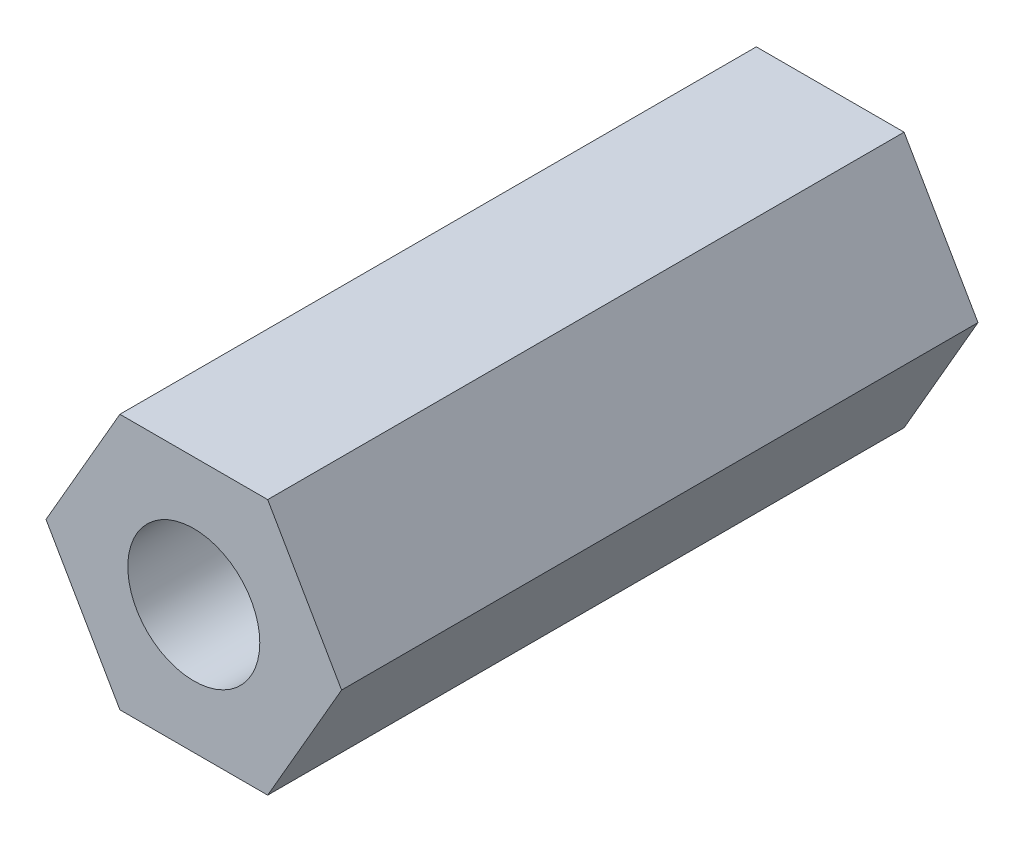
ISO-10303-21;
HEADER;
FILE_DESCRIPTION(('STEP AP214'),'2;1');
FILE_NAME('part.step','',(''),(''),'','','');
FILE_SCHEMA(('AUTOMOTIVE_DESIGN { 1 0 10303 214 1 1 1 1 }'));
ENDSEC;
DATA;
#1=APPLICATION_CONTEXT('core data for automotive mechanical design processes');
#2=APPLICATION_PROTOCOL_DEFINITION('international standard','automotive_design',2000,#1);
#3=PRODUCT_CONTEXT('',#1,'mechanical');
#4=PRODUCT('Part','Part','',(#3));
#5=PRODUCT_RELATED_PRODUCT_CATEGORY('part','',(#4));
#6=PRODUCT_DEFINITION_FORMATION('','',#4);
#7=PRODUCT_DEFINITION_CONTEXT('part definition',#1,'design');
#8=PRODUCT_DEFINITION('design','',#6,#7);
#9=PRODUCT_DEFINITION_SHAPE('','',#8);
#10=(LENGTH_UNIT() NAMED_UNIT(*) SI_UNIT(.MILLI.,.METRE.));
#11=(NAMED_UNIT(*) PLANE_ANGLE_UNIT() SI_UNIT($,.RADIAN.));
#12=(NAMED_UNIT(*) SI_UNIT($,.STERADIAN.) SOLID_ANGLE_UNIT());
#13=UNCERTAINTY_MEASURE_WITH_UNIT(LENGTH_MEASURE(1.E-05),#10,'distance_accuracy_value','');
#14=(GEOMETRIC_REPRESENTATION_CONTEXT(3) GLOBAL_UNCERTAINTY_ASSIGNED_CONTEXT((#13)) GLOBAL_UNIT_ASSIGNED_CONTEXT((#10,
#11,#12)) REPRESENTATION_CONTEXT('',''));
#15=CARTESIAN_POINT('',(0.,0.,0.));
#16=DIRECTION('',(0.,0.,1.));
#17=DIRECTION('',(1.,0.,0.));
#18=AXIS2_PLACEMENT_3D('',#15,#16,#17);
#19=CARTESIAN_POINT('',(0.,0.,13.5));
#20=DIRECTION('',(0.,0.,1.));
#21=DIRECTION('',(1.,0.,0.));
#22=AXIS2_PLACEMENT_3D('',#19,#20,#21);
#23=PLANE('',#22);
#24=DIRECTION('',(1.,0.,0.));
#25=VECTOR('',#24,1.);
#26=CARTESIAN_POINT('',(-1.56750598084983,-2.715,13.5));
#27=LINE('',#26,#25);
#28=CARTESIAN_POINT('',(-1.56750598084983,-2.715,13.5));
#29=VERTEX_POINT('',#28);
#30=CARTESIAN_POINT('',(1.56750598084983,-2.715,13.5));
#31=VERTEX_POINT('',#30);
#32=EDGE_CURVE('E146',#29,#31,#27,.T.);
#33=ORIENTED_EDGE('',*,*,#32,.T.);
#34=DIRECTION('',(0.5,0.866025403784439,0.));
#35=VECTOR('',#34,1.);
#36=CARTESIAN_POINT('',(1.56750598084983,-2.715,13.5));
#37=LINE('',#36,#35);
#38=CARTESIAN_POINT('',(3.13501196169967,0.,13.5));
#39=VERTEX_POINT('',#38);
#40=EDGE_CURVE('E94',#31,#39,#37,.T.);
#41=ORIENTED_EDGE('',*,*,#40,.T.);
#42=DIRECTION('',(-0.5,0.866025403784439,0.));
#43=VECTOR('',#42,1.);
#44=CARTESIAN_POINT('',(3.13501196169967,0.,13.5));
#45=LINE('',#44,#43);
#46=CARTESIAN_POINT('',(1.56750598084983,2.715,13.5));
#47=VERTEX_POINT('',#46);
#48=EDGE_CURVE('E107',#39,#47,#45,.T.);
#49=ORIENTED_EDGE('',*,*,#48,.T.);
#50=DIRECTION('',(-1.,0.,0.));
#51=VECTOR('',#50,1.);
#52=CARTESIAN_POINT('',(1.56750598084983,2.715,13.5));
#53=LINE('',#52,#51);
#54=CARTESIAN_POINT('',(-1.56750598084983,2.715,13.5));
#55=VERTEX_POINT('',#54);
#56=EDGE_CURVE('E101',#47,#55,#53,.T.);
#57=ORIENTED_EDGE('',*,*,#56,.T.);
#58=DIRECTION('',(-0.5,-0.866025403784439,0.));
#59=VECTOR('',#58,1.);
#60=CARTESIAN_POINT('',(-1.56750598084983,2.715,13.5));
#61=LINE('',#60,#59);
#62=CARTESIAN_POINT('',(-3.13501196169967,0.,13.5));
#63=VERTEX_POINT('',#62);
#64=EDGE_CURVE('E105',#55,#63,#61,.T.);
#65=ORIENTED_EDGE('',*,*,#64,.T.);
#66=DIRECTION('',(0.5,-0.866025403784438,0.));
#67=VECTOR('',#66,1.);
#68=CARTESIAN_POINT('',(-3.13501196169967,0.,13.5));
#69=LINE('',#68,#67);
#70=EDGE_CURVE('E57',#63,#29,#69,.T.);
#71=ORIENTED_EDGE('',*,*,#70,.T.);
#72=EDGE_LOOP('',(#33,#41,#49,#57,#65,#71));
#73=FACE_BOUND('',#72,.T.);
#74=CARTESIAN_POINT('',(0.,0.,13.5));
#75=DIRECTION('',(0.,0.,1.));
#76=DIRECTION('',(1.,0.,0.));
#77=AXIS2_PLACEMENT_3D('',#74,#75,#76);
#78=CIRCLE('',#77,1.4);
#79=CARTESIAN_POINT('',(1.4,0.,13.5));
#80=VERTEX_POINT('',#79);
#81=EDGE_CURVE('E134',#80,#80,#78,.T.);
#82=ORIENTED_EDGE('',*,*,#81,.F.);
#83=EDGE_LOOP('',(#82));
#84=FACE_BOUND('',#83,.T.);
#85=ADVANCED_FACE('F39',(#73,#84),#23,.T.);
#86=CARTESIAN_POINT('',(0.,0.,0.));
#87=DIRECTION('',(0.,0.,1.));
#88=DIRECTION('',(1.,0.,0.));
#89=AXIS2_PLACEMENT_3D('',#86,#87,#88);
#90=PLANE('',#89);
#91=DIRECTION('',(1.,0.,0.));
#92=VECTOR('',#91,1.);
#93=CARTESIAN_POINT('',(-1.56750598084983,-2.715,0.));
#94=LINE('',#93,#92);
#95=CARTESIAN_POINT('',(-1.56750598084983,-2.715,0.));
#96=VERTEX_POINT('',#95);
#97=CARTESIAN_POINT('',(1.56750598084983,-2.715,0.));
#98=VERTEX_POINT('',#97);
#99=EDGE_CURVE('E129',#96,#98,#94,.T.);
#100=ORIENTED_EDGE('',*,*,#99,.F.);
#101=DIRECTION('',(0.5,-0.866025403784438,0.));
#102=VECTOR('',#101,1.);
#103=CARTESIAN_POINT('',(-3.13501196169967,0.,0.));
#104=LINE('',#103,#102);
#105=CARTESIAN_POINT('',(-3.13501196169967,0.,0.));
#106=VERTEX_POINT('',#105);
#107=EDGE_CURVE('E86',#106,#96,#104,.T.);
#108=ORIENTED_EDGE('',*,*,#107,.F.);
#109=DIRECTION('',(-0.5,-0.866025403784439,0.));
#110=VECTOR('',#109,1.);
#111=CARTESIAN_POINT('',(-1.56750598084983,2.715,0.));
#112=LINE('',#111,#110);
#113=CARTESIAN_POINT('',(-1.56750598084983,2.715,0.));
#114=VERTEX_POINT('',#113);
#115=EDGE_CURVE('E80',#114,#106,#112,.T.);
#116=ORIENTED_EDGE('',*,*,#115,.F.);
#117=DIRECTION('',(-1.,0.,0.));
#118=VECTOR('',#117,1.);
#119=CARTESIAN_POINT('',(1.56750598084983,2.715,0.));
#120=LINE('',#119,#118);
#121=CARTESIAN_POINT('',(1.56750598084983,2.715,0.));
#122=VERTEX_POINT('',#121);
#123=EDGE_CURVE('E116',#122,#114,#120,.T.);
#124=ORIENTED_EDGE('',*,*,#123,.F.);
#125=DIRECTION('',(-0.5,0.866025403784439,0.));
#126=VECTOR('',#125,1.);
#127=CARTESIAN_POINT('',(3.13501196169967,0.,0.));
#128=LINE('',#127,#126);
#129=CARTESIAN_POINT('',(3.13501196169967,0.,0.));
#130=VERTEX_POINT('',#129);
#131=EDGE_CURVE('E137',#130,#122,#128,.T.);
#132=ORIENTED_EDGE('',*,*,#131,.F.);
#133=DIRECTION('',(0.5,0.866025403784439,0.));
#134=VECTOR('',#133,1.);
#135=CARTESIAN_POINT('',(1.56750598084983,-2.715,0.));
#136=LINE('',#135,#134);
#137=EDGE_CURVE('E133',#98,#130,#136,.T.);
#138=ORIENTED_EDGE('',*,*,#137,.F.);
#139=EDGE_LOOP('',(#100,#108,#116,#124,#132,#138));
#140=FACE_BOUND('',#139,.T.);
#141=CARTESIAN_POINT('',(0.,0.,0.));
#142=DIRECTION('',(0.,0.,1.));
#143=DIRECTION('',(1.,0.,0.));
#144=AXIS2_PLACEMENT_3D('',#141,#142,#143);
#145=CIRCLE('',#144,1.4);
#146=CARTESIAN_POINT('',(1.4,0.,0.));
#147=VERTEX_POINT('',#146);
#148=EDGE_CURVE('E243',#147,#147,#145,.T.);
#149=ORIENTED_EDGE('',*,*,#148,.T.);
#150=EDGE_LOOP('',(#149));
#151=FACE_BOUND('',#150,.T.);
#152=ADVANCED_FACE('F159',(#140,#151),#90,.F.);
#153=CARTESIAN_POINT('',(-1.56750598084983,-2.715,13.5));
#154=DIRECTION('',(0.,1.,0.));
#155=DIRECTION('',(-1.,0.,0.));
#156=AXIS2_PLACEMENT_3D('',#153,#154,#155);
#157=PLANE('',#156);
#158=ORIENTED_EDGE('',*,*,#99,.T.);
#159=DIRECTION('',(0.,0.,-1.));
#160=VECTOR('',#159,1.);
#161=CARTESIAN_POINT('',(1.56750598084983,-2.715,13.5));
#162=LINE('',#161,#160);
#163=EDGE_CURVE('E11',#31,#98,#162,.T.);
#164=ORIENTED_EDGE('',*,*,#163,.F.);
#165=ORIENTED_EDGE('',*,*,#32,.F.);
#166=DIRECTION('',(0.,0.,-1.));
#167=VECTOR('',#166,1.);
#168=CARTESIAN_POINT('',(-1.56750598084983,-2.715,13.5));
#169=LINE('',#168,#167);
#170=EDGE_CURVE('E125',#29,#96,#169,.T.);
#171=ORIENTED_EDGE('',*,*,#170,.T.);
#172=EDGE_LOOP('',(#158,#164,#165,#171));
#173=FACE_BOUND('',#172,.T.);
#174=ADVANCED_FACE('F41',(#173),#157,.F.);
#175=CARTESIAN_POINT('',(1.56750598084983,-2.715,13.5));
#176=DIRECTION('',(-0.866025403784439,0.5,0.));
#177=DIRECTION('',(-0.5,-0.866025403784439,0.));
#178=AXIS2_PLACEMENT_3D('',#175,#176,#177);
#179=PLANE('',#178);
#180=ORIENTED_EDGE('',*,*,#137,.T.);
#181=DIRECTION('',(0.,0.,-1.));
#182=VECTOR('',#181,1.);
#183=CARTESIAN_POINT('',(3.13501196169967,0.,13.5));
#184=LINE('',#183,#182);
#185=EDGE_CURVE('E49',#39,#130,#184,.T.);
#186=ORIENTED_EDGE('',*,*,#185,.F.);
#187=ORIENTED_EDGE('',*,*,#40,.F.);
#188=ORIENTED_EDGE('',*,*,#163,.T.);
#189=EDGE_LOOP('',(#180,#186,#187,#188));
#190=FACE_BOUND('',#189,.T.);
#191=ADVANCED_FACE('F184',(#190),#179,.F.);
#192=CARTESIAN_POINT('',(3.13501196169967,0.,13.5));
#193=DIRECTION('',(-0.866025403784439,-0.5,0.));
#194=DIRECTION('',(0.5,-0.866025403784439,0.));
#195=AXIS2_PLACEMENT_3D('',#192,#193,#194);
#196=PLANE('',#195);
#197=ORIENTED_EDGE('',*,*,#131,.T.);
#198=DIRECTION('',(0.,0.,-1.));
#199=VECTOR('',#198,1.);
#200=CARTESIAN_POINT('',(1.56750598084983,2.715,13.5));
#201=LINE('',#200,#199);
#202=EDGE_CURVE('E118',#47,#122,#201,.T.);
#203=ORIENTED_EDGE('',*,*,#202,.F.);
#204=ORIENTED_EDGE('',*,*,#48,.F.);
#205=ORIENTED_EDGE('',*,*,#185,.T.);
#206=EDGE_LOOP('',(#197,#203,#204,#205));
#207=FACE_BOUND('',#206,.T.);
#208=ADVANCED_FACE('F156',(#207),#196,.F.);
#209=CARTESIAN_POINT('',(1.56750598084983,2.715,13.5));
#210=DIRECTION('',(0.,-1.,0.));
#211=DIRECTION('',(0.,0.,-1.));
#212=AXIS2_PLACEMENT_3D('',#209,#210,#211);
#213=PLANE('',#212);
#214=ORIENTED_EDGE('',*,*,#123,.T.);
#215=DIRECTION('',(0.,0.,-1.));
#216=VECTOR('',#215,1.);
#217=CARTESIAN_POINT('',(-1.56750598084983,2.715,13.5));
#218=LINE('',#217,#216);
#219=EDGE_CURVE('E113',#55,#114,#218,.T.);
#220=ORIENTED_EDGE('',*,*,#219,.F.);
#221=ORIENTED_EDGE('',*,*,#56,.F.);
#222=ORIENTED_EDGE('',*,*,#202,.T.);
#223=EDGE_LOOP('',(#214,#220,#221,#222));
#224=FACE_BOUND('',#223,.T.);
#225=ADVANCED_FACE('F114',(#224),#213,.F.);
#226=CARTESIAN_POINT('',(-1.56750598084983,2.715,13.5));
#227=DIRECTION('',(0.866025403784439,-0.5,0.));
#228=DIRECTION('',(0.5,0.866025403784439,0.));
#229=AXIS2_PLACEMENT_3D('',#226,#227,#228);
#230=PLANE('',#229);
#231=ORIENTED_EDGE('',*,*,#115,.T.);
#232=DIRECTION('',(0.,0.,-1.));
#233=VECTOR('',#232,1.);
#234=CARTESIAN_POINT('',(-3.13501196169967,0.,13.5));
#235=LINE('',#234,#233);
#236=EDGE_CURVE('E119',#63,#106,#235,.T.);
#237=ORIENTED_EDGE('',*,*,#236,.F.);
#238=ORIENTED_EDGE('',*,*,#64,.F.);
#239=ORIENTED_EDGE('',*,*,#219,.T.);
#240=EDGE_LOOP('',(#231,#237,#238,#239));
#241=FACE_BOUND('',#240,.T.);
#242=ADVANCED_FACE('F121',(#241),#230,.F.);
#243=CARTESIAN_POINT('',(-3.13501196169967,0.,13.5));
#244=DIRECTION('',(0.866025403784438,0.5,0.));
#245=DIRECTION('',(-0.5,0.866025403784438,0.));
#246=AXIS2_PLACEMENT_3D('',#243,#244,#245);
#247=PLANE('',#246);
#248=ORIENTED_EDGE('',*,*,#107,.T.);
#249=ORIENTED_EDGE('',*,*,#170,.F.);
#250=ORIENTED_EDGE('',*,*,#70,.F.);
#251=ORIENTED_EDGE('',*,*,#236,.T.);
#252=EDGE_LOOP('',(#248,#249,#250,#251));
#253=FACE_BOUND('',#252,.T.);
#254=ADVANCED_FACE('F164',(#253),#247,.F.);
#255=CARTESIAN_POINT('',(0.,0.,13.5));
#256=DIRECTION('',(0.,0.,-1.));
#257=DIRECTION('',(-1.,0.,0.));
#258=AXIS2_PLACEMENT_3D('',#255,#256,#257);
#259=CYLINDRICAL_SURFACE('',#258,1.4);
#260=ORIENTED_EDGE('',*,*,#81,.T.);
#261=EDGE_LOOP('',(#260));
#262=FACE_BOUND('',#261,.T.);
#263=ORIENTED_EDGE('',*,*,#148,.F.);
#264=EDGE_LOOP('',(#263));
#265=FACE_BOUND('',#264,.T.);
#266=ADVANCED_FACE('F166',(#262,#265),#259,.F.);
#267=CLOSED_SHELL('',(#85,#152,#174,#191,#208,#225,#242,#254,#266));
#268=MANIFOLD_SOLID_BREP('B2',#267);
#269=ADVANCED_BREP_SHAPE_REPRESENTATION('',(#18,#268),#14);
#270=SHAPE_DEFINITION_REPRESENTATION(#9,#269);
ENDSEC;
END-ISO-10303-21;
